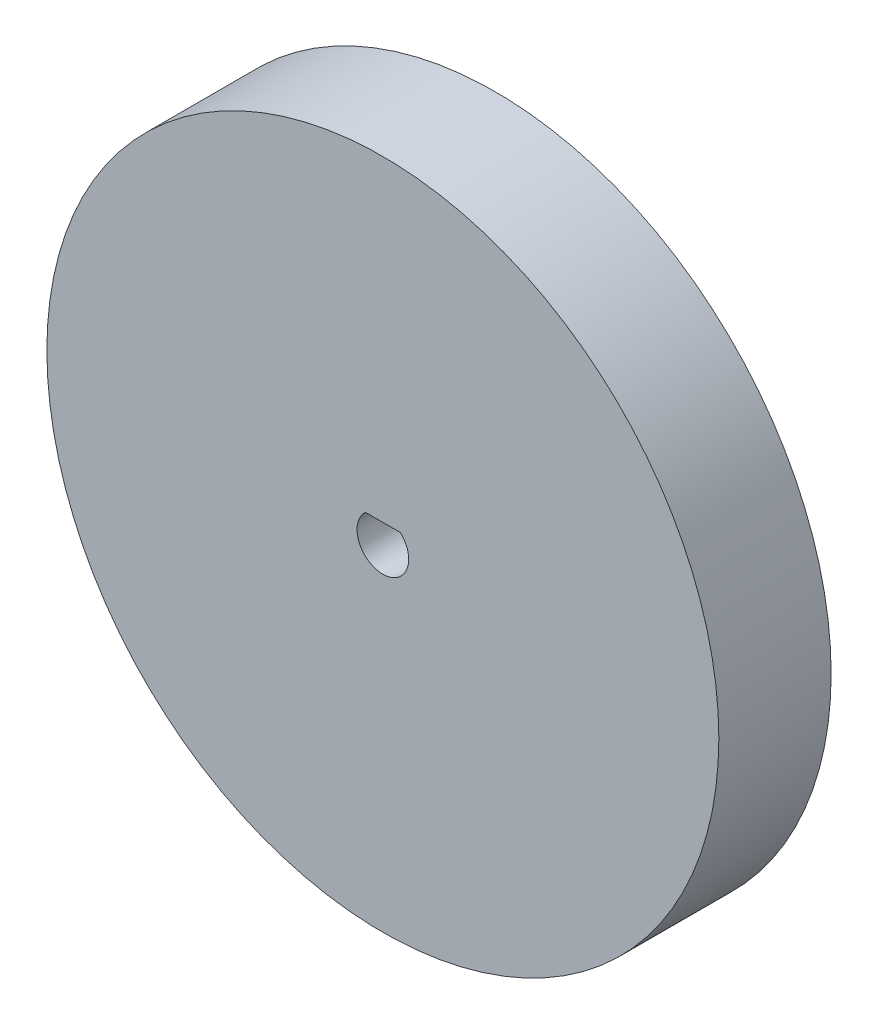
ISO-10303-21;
HEADER;
FILE_DESCRIPTION(('STEP AP214'),'2;1');
FILE_NAME('part.step','',(''),(''),'','','');
FILE_SCHEMA(('AUTOMOTIVE_DESIGN { 1 0 10303 214 1 1 1 1 }'));
ENDSEC;
DATA;
#1=APPLICATION_CONTEXT('core data for automotive mechanical design processes');
#2=APPLICATION_PROTOCOL_DEFINITION('international standard','automotive_design',2000,#1);
#3=PRODUCT_CONTEXT('',#1,'mechanical');
#4=PRODUCT('Part','Part','',(#3));
#5=PRODUCT_RELATED_PRODUCT_CATEGORY('part','',(#4));
#6=PRODUCT_DEFINITION_FORMATION('','',#4);
#7=PRODUCT_DEFINITION_CONTEXT('part definition',#1,'design');
#8=PRODUCT_DEFINITION('design','',#6,#7);
#9=PRODUCT_DEFINITION_SHAPE('','',#8);
#10=(LENGTH_UNIT() NAMED_UNIT(*) SI_UNIT(.MILLI.,.METRE.));
#11=(NAMED_UNIT(*) PLANE_ANGLE_UNIT() SI_UNIT($,.RADIAN.));
#12=(NAMED_UNIT(*) SI_UNIT($,.STERADIAN.) SOLID_ANGLE_UNIT());
#13=UNCERTAINTY_MEASURE_WITH_UNIT(LENGTH_MEASURE(1.E-05),#10,'distance_accuracy_value','');
#14=(GEOMETRIC_REPRESENTATION_CONTEXT(3) GLOBAL_UNCERTAINTY_ASSIGNED_CONTEXT((#13)) GLOBAL_UNIT_ASSIGNED_CONTEXT((#10,
#11,#12)) REPRESENTATION_CONTEXT('',''));
#15=CARTESIAN_POINT('',(0.,0.,0.));
#16=DIRECTION('',(0.,0.,1.));
#17=DIRECTION('',(1.,0.,0.));
#18=AXIS2_PLACEMENT_3D('',#15,#16,#17);
#19=CARTESIAN_POINT('',(0.,0.,12.7));
#20=DIRECTION('',(0.,0.,-1.));
#21=DIRECTION('',(-1.,0.,0.));
#22=AXIS2_PLACEMENT_3D('',#19,#20,#21);
#23=CYLINDRICAL_SURFACE('',#22,37.999999946);
#24=CARTESIAN_POINT('',(0.,0.,12.7));
#25=DIRECTION('',(0.,0.,1.));
#26=DIRECTION('',(1.,0.,0.));
#27=AXIS2_PLACEMENT_3D('',#24,#25,#26);
#28=CIRCLE('',#27,37.999999946);
#29=CARTESIAN_POINT('',(37.999999946,0.,12.7));
#30=VERTEX_POINT('',#29);
#31=EDGE_CURVE('E11',#30,#30,#28,.T.);
#32=ORIENTED_EDGE('',*,*,#31,.F.);
#33=EDGE_LOOP('',(#32));
#34=FACE_BOUND('',#33,.T.);
#35=CARTESIAN_POINT('',(0.,0.,0.));
#36=DIRECTION('',(0.,0.,1.));
#37=DIRECTION('',(1.,0.,0.));
#38=AXIS2_PLACEMENT_3D('',#35,#36,#37);
#39=CIRCLE('',#38,37.999999946);
#40=CARTESIAN_POINT('',(37.999999946,0.,0.));
#41=VERTEX_POINT('',#40);
#42=EDGE_CURVE('E36',#41,#41,#39,.T.);
#43=ORIENTED_EDGE('',*,*,#42,.T.);
#44=EDGE_LOOP('',(#43));
#45=FACE_BOUND('',#44,.T.);
#46=ADVANCED_FACE('F33',(#34,#45),#23,.T.);
#47=CARTESIAN_POINT('',(0.,0.,12.7));
#48=DIRECTION('',(0.,0.,1.));
#49=DIRECTION('',(1.,0.,0.));
#50=AXIS2_PLACEMENT_3D('',#47,#48,#49);
#51=PLANE('',#50);
#52=CARTESIAN_POINT('',(0.,0.,12.7));
#53=DIRECTION('',(0.,0.,1.));
#54=DIRECTION('',(-1.,0.,0.));
#55=AXIS2_PLACEMENT_3D('',#52,#53,#54);
#56=CIRCLE('',#55,2.921);
#57=CARTESIAN_POINT('',(-1.96747553987337,2.159,12.7));
#58=VERTEX_POINT('',#57);
#59=CARTESIAN_POINT('',(1.96747553987337,2.159,12.7));
#60=VERTEX_POINT('',#59);
#61=EDGE_CURVE('E47',#58,#60,#56,.T.);
#62=ORIENTED_EDGE('',*,*,#61,.F.);
#63=DIRECTION('',(-1.,0.,0.));
#64=VECTOR('',#63,1.);
#65=CARTESIAN_POINT('',(1.96747553987337,2.159,12.7));
#66=LINE('',#65,#64);
#67=EDGE_CURVE('E66',#60,#58,#66,.T.);
#68=ORIENTED_EDGE('',*,*,#67,.F.);
#69=EDGE_LOOP('',(#62,#68));
#70=FACE_BOUND('',#69,.T.);
#71=ORIENTED_EDGE('',*,*,#31,.T.);
#72=EDGE_LOOP('',(#71));
#73=FACE_BOUND('',#72,.T.);
#74=ADVANCED_FACE('F70',(#70,#73),#51,.T.);
#75=CARTESIAN_POINT('',(0.,0.,0.));
#76=DIRECTION('',(0.,0.,1.));
#77=DIRECTION('',(1.,0.,0.));
#78=AXIS2_PLACEMENT_3D('',#75,#76,#77);
#79=PLANE('',#78);
#80=DIRECTION('',(-1.,0.,0.));
#81=VECTOR('',#80,1.);
#82=CARTESIAN_POINT('',(1.96747553987337,2.159,0.));
#83=LINE('',#82,#81);
#84=CARTESIAN_POINT('',(1.96747553987337,2.159,0.));
#85=VERTEX_POINT('',#84);
#86=CARTESIAN_POINT('',(-1.96747553987337,2.159,0.));
#87=VERTEX_POINT('',#86);
#88=EDGE_CURVE('E74',#85,#87,#83,.T.);
#89=ORIENTED_EDGE('',*,*,#88,.T.);
#90=CARTESIAN_POINT('',(0.,0.,0.));
#91=DIRECTION('',(0.,0.,1.));
#92=DIRECTION('',(-1.,0.,0.));
#93=AXIS2_PLACEMENT_3D('',#90,#91,#92);
#94=CIRCLE('',#93,2.921);
#95=EDGE_CURVE('E52',#87,#85,#94,.T.);
#96=ORIENTED_EDGE('',*,*,#95,.T.);
#97=EDGE_LOOP('',(#89,#96));
#98=FACE_BOUND('',#97,.T.);
#99=ORIENTED_EDGE('',*,*,#42,.F.);
#100=EDGE_LOOP('',(#99));
#101=FACE_BOUND('',#100,.T.);
#102=ADVANCED_FACE('F78',(#98,#101),#79,.F.);
#103=CARTESIAN_POINT('',(0.,0.,0.));
#104=DIRECTION('',(0.,0.,1.));
#105=DIRECTION('',(1.,0.,0.));
#106=AXIS2_PLACEMENT_3D('',#103,#104,#105);
#107=CYLINDRICAL_SURFACE('',#106,2.921);
#108=ORIENTED_EDGE('',*,*,#61,.T.);
#109=DIRECTION('',(0.,0.,1.));
#110=VECTOR('',#109,1.);
#111=CARTESIAN_POINT('',(1.96747553987337,2.159,0.));
#112=LINE('',#111,#110);
#113=EDGE_CURVE('E63',#85,#60,#112,.T.);
#114=ORIENTED_EDGE('',*,*,#113,.F.);
#115=ORIENTED_EDGE('',*,*,#95,.F.);
#116=DIRECTION('',(0.,0.,1.));
#117=VECTOR('',#116,1.);
#118=CARTESIAN_POINT('',(-1.96747553987337,2.159,0.));
#119=LINE('',#118,#117);
#120=EDGE_CURVE('E57',#87,#58,#119,.T.);
#121=ORIENTED_EDGE('',*,*,#120,.T.);
#122=EDGE_LOOP('',(#108,#114,#115,#121));
#123=FACE_BOUND('',#122,.T.);
#124=ADVANCED_FACE('F59',(#123),#107,.F.);
#125=CARTESIAN_POINT('',(1.96747553987337,2.159,0.));
#126=DIRECTION('',(0.,1.,0.));
#127=DIRECTION('',(0.,0.,1.));
#128=AXIS2_PLACEMENT_3D('',#125,#126,#127);
#129=PLANE('',#128);
#130=ORIENTED_EDGE('',*,*,#67,.T.);
#131=ORIENTED_EDGE('',*,*,#120,.F.);
#132=ORIENTED_EDGE('',*,*,#88,.F.);
#133=ORIENTED_EDGE('',*,*,#113,.T.);
#134=EDGE_LOOP('',(#130,#131,#132,#133));
#135=FACE_BOUND('',#134,.T.);
#136=ADVANCED_FACE('F67',(#135),#129,.F.);
#137=CLOSED_SHELL('',(#46,#74,#102,#124,#136));
#138=MANIFOLD_SOLID_BREP('B2',#137);
#139=ADVANCED_BREP_SHAPE_REPRESENTATION('',(#18,#138),#14);
#140=SHAPE_DEFINITION_REPRESENTATION(#9,#139);
ENDSEC;
END-ISO-10303-21;
